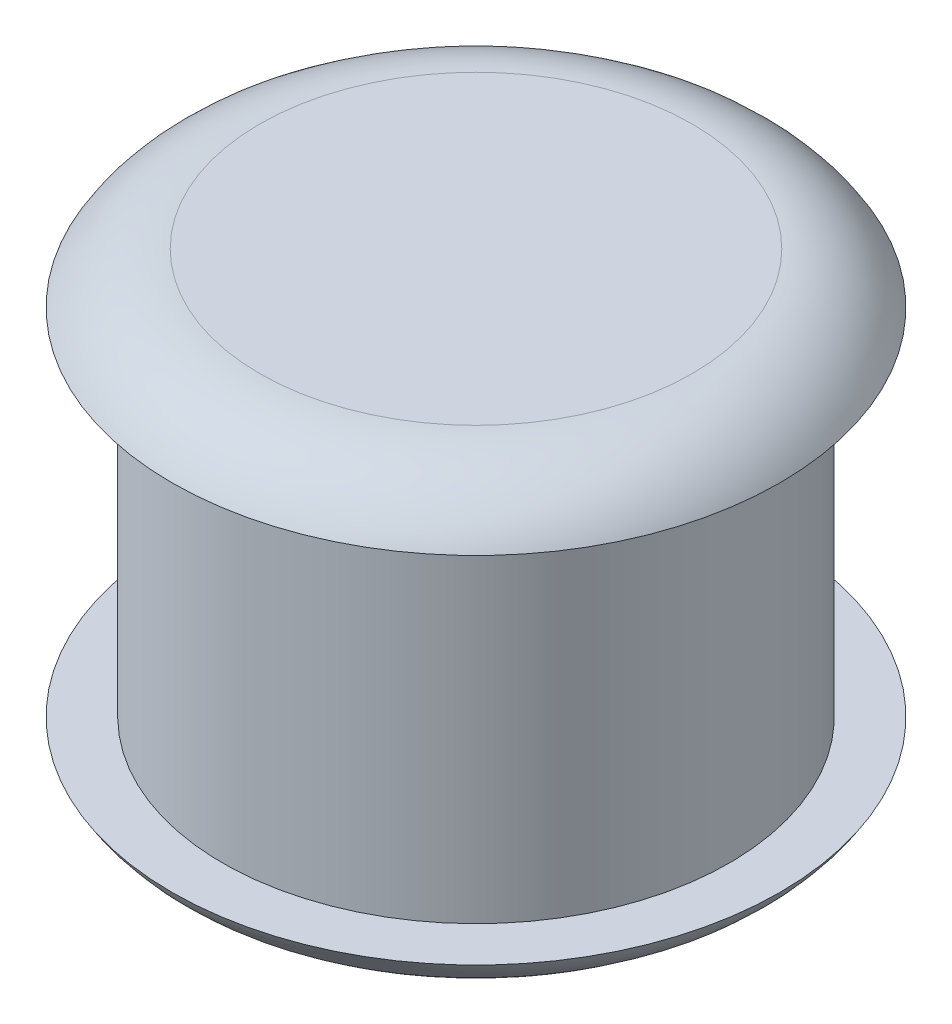
ISO-10303-21;
HEADER;
FILE_DESCRIPTION(('STEP AP214'),'2;1');
FILE_NAME('part.step','',(''),(''),'','','');
FILE_SCHEMA(('AUTOMOTIVE_DESIGN { 1 0 10303 214 1 1 1 1 }'));
ENDSEC;
DATA;
#1=APPLICATION_CONTEXT('core data for automotive mechanical design processes');
#2=APPLICATION_PROTOCOL_DEFINITION('international standard','automotive_design',2000,#1);
#3=PRODUCT_CONTEXT('',#1,'mechanical');
#4=PRODUCT('Part','Part','',(#3));
#5=PRODUCT_RELATED_PRODUCT_CATEGORY('part','',(#4));
#6=PRODUCT_DEFINITION_FORMATION('','',#4);
#7=PRODUCT_DEFINITION_CONTEXT('part definition',#1,'design');
#8=PRODUCT_DEFINITION('design','',#6,#7);
#9=PRODUCT_DEFINITION_SHAPE('','',#8);
#10=(LENGTH_UNIT() NAMED_UNIT(*) SI_UNIT(.MILLI.,.METRE.));
#11=(NAMED_UNIT(*) PLANE_ANGLE_UNIT() SI_UNIT($,.RADIAN.));
#12=(NAMED_UNIT(*) SI_UNIT($,.STERADIAN.) SOLID_ANGLE_UNIT());
#13=UNCERTAINTY_MEASURE_WITH_UNIT(LENGTH_MEASURE(1.E-05),#10,'distance_accuracy_value','');
#14=(GEOMETRIC_REPRESENTATION_CONTEXT(3) GLOBAL_UNCERTAINTY_ASSIGNED_CONTEXT((#13)) GLOBAL_UNIT_ASSIGNED_CONTEXT((#10,
#11,#12)) REPRESENTATION_CONTEXT('',''));
#15=CARTESIAN_POINT('',(0.,0.,0.));
#16=DIRECTION('',(0.,0.,1.));
#17=DIRECTION('',(1.,0.,0.));
#18=AXIS2_PLACEMENT_3D('',#15,#16,#17);
#19=CARTESIAN_POINT('',(0.,-179.614285714286,0.));
#20=DIRECTION('',(0.,1.,0.));
#21=DIRECTION('',(0.,0.,1.));
#22=AXIS2_PLACEMENT_3D('',#19,#20,#21);
#23=PLANE('',#22);
#24=CARTESIAN_POINT('',(0.,-179.614285714286,0.));
#25=DIRECTION('',(0.,1.,0.));
#26=DIRECTION('',(0.,0.,1.));
#27=AXIS2_PLACEMENT_3D('',#24,#25,#26);
#28=CIRCLE('',#27,46.4596754947502);
#29=CARTESIAN_POINT('',(0.,-179.614285714286,46.4596754947502));
#30=VERTEX_POINT('',#29);
#31=EDGE_CURVE('E10',#30,#30,#28,.T.);
#32=ORIENTED_EDGE('',*,*,#31,.T.);
#33=EDGE_LOOP('',(#32));
#34=FACE_BOUND('',#33,.T.);
#35=ADVANCED_FACE('F33',(#34),#23,.T.);
#36=CARTESIAN_POINT('',(65.3142857142857,-190.5,0.));
#37=DIRECTION('',(0.,-1.,0.));
#38=DIRECTION('',(0.,0.,-1.));
#39=AXIS2_PLACEMENT_3D('',#36,#37,#38);
#40=PLANE('',#39);
#41=CARTESIAN_POINT('',(0.,-190.5,0.));
#42=DIRECTION('',(0.,-1.,0.));
#43=DIRECTION('',(0.,0.,-1.));
#44=AXIS2_PLACEMENT_3D('',#41,#42,#43);
#45=CIRCLE('',#44,65.3142857142857);
#46=CARTESIAN_POINT('',(0.,-190.5,-65.3142857142857));
#47=VERTEX_POINT('',#46);
#48=EDGE_CURVE('E44',#47,#47,#45,.T.);
#49=ORIENTED_EDGE('',*,*,#48,.T.);
#50=EDGE_LOOP('',(#49));
#51=FACE_BOUND('',#50,.T.);
#52=CARTESIAN_POINT('',(0.,-190.5,0.));
#53=DIRECTION('',(0.,-1.,0.));
#54=DIRECTION('',(0.,0.,-1.));
#55=AXIS2_PLACEMENT_3D('',#52,#53,#54);
#56=CIRCLE('',#55,54.4285714285714);
#57=CARTESIAN_POINT('',(0.,-190.5,-54.4285714285714));
#58=VERTEX_POINT('',#57);
#59=EDGE_CURVE('E48',#58,#58,#56,.T.);
#60=ORIENTED_EDGE('',*,*,#59,.F.);
#61=EDGE_LOOP('',(#60));
#62=FACE_BOUND('',#61,.T.);
#63=ADVANCED_FACE('F74',(#51,#62),#40,.T.);
#64=CARTESIAN_POINT('',(0.,-277.585714285714,0.));
#65=DIRECTION('',(0.,-1.,0.));
#66=DIRECTION('',(0.,0.,-1.));
#67=AXIS2_PLACEMENT_3D('',#64,#65,#66);
#68=CYLINDRICAL_SURFACE('',#67,54.4285714285714);
#69=ORIENTED_EDGE('',*,*,#59,.T.);
#70=EDGE_LOOP('',(#69));
#71=FACE_BOUND('',#70,.T.);
#72=CARTESIAN_POINT('',(0.,-266.7,0.));
#73=DIRECTION('',(0.,-1.,0.));
#74=DIRECTION('',(0.,0.,-1.));
#75=AXIS2_PLACEMENT_3D('',#72,#73,#74);
#76=CIRCLE('',#75,54.4285714285714);
#77=CARTESIAN_POINT('',(0.,-266.7,-54.4285714285714));
#78=VERTEX_POINT('',#77);
#79=EDGE_CURVE('E53',#78,#78,#76,.T.);
#80=ORIENTED_EDGE('',*,*,#79,.F.);
#81=EDGE_LOOP('',(#80));
#82=FACE_BOUND('',#81,.T.);
#83=ADVANCED_FACE('F66',(#71,#82),#68,.T.);
#84=CARTESIAN_POINT('',(54.4285714285714,-266.7,0.));
#85=DIRECTION('',(0.,1.,0.));
#86=DIRECTION('',(0.,0.,1.));
#87=AXIS2_PLACEMENT_3D('',#84,#85,#86);
#88=PLANE('',#87);
#89=ORIENTED_EDGE('',*,*,#79,.T.);
#90=EDGE_LOOP('',(#89));
#91=FACE_BOUND('',#90,.T.);
#92=CARTESIAN_POINT('',(0.,-266.7,0.));
#93=DIRECTION('',(0.,-1.,0.));
#94=DIRECTION('',(0.,0.,-1.));
#95=AXIS2_PLACEMENT_3D('',#92,#93,#94);
#96=CIRCLE('',#95,65.3142857142857);
#97=CARTESIAN_POINT('',(0.,-266.7,-65.3142857142857));
#98=VERTEX_POINT('',#97);
#99=EDGE_CURVE('E56',#98,#98,#96,.T.);
#100=ORIENTED_EDGE('',*,*,#99,.F.);
#101=EDGE_LOOP('',(#100));
#102=FACE_BOUND('',#101,.T.);
#103=ADVANCED_FACE('F63',(#91,#102),#88,.T.);
#104=CARTESIAN_POINT('',(65.3142857142857,-277.585714285714,0.));
#105=DIRECTION('',(0.,-1.,0.));
#106=DIRECTION('',(0.,0.,-1.));
#107=AXIS2_PLACEMENT_3D('',#104,#105,#106);
#108=PLANE('',#107);
#109=CARTESIAN_POINT('',(0.,-277.585714285714,0.));
#110=DIRECTION('',(0.,-1.,0.));
#111=DIRECTION('',(0.,0.,-1.));
#112=AXIS2_PLACEMENT_3D('',#109,#110,#111);
#113=CIRCLE('',#112,46.4596754947502);
#114=CARTESIAN_POINT('',(0.,-277.585714285714,-46.4596754947502));
#115=VERTEX_POINT('',#114);
#116=EDGE_CURVE('E40',#115,#115,#113,.T.);
#117=ORIENTED_EDGE('',*,*,#116,.T.);
#118=EDGE_LOOP('',(#117));
#119=FACE_BOUND('',#118,.T.);
#120=ADVANCED_FACE('F65',(#119),#108,.T.);
#121=CARTESIAN_POINT('',(0.,-255.814285714286,0.));
#122=DIRECTION('',(0.,1.,0.));
#123=DIRECTION('',(0.,0.,1.));
#124=AXIS2_PLACEMENT_3D('',#121,#122,#123);
#125=TOROIDAL_SURFACE('',#124,46.4596754947502,21.7714285714286);
#126=ORIENTED_EDGE('',*,*,#99,.T.);
#127=EDGE_LOOP('',(#126));
#128=FACE_BOUND('',#127,.T.);
#129=ORIENTED_EDGE('',*,*,#116,.F.);
#130=EDGE_LOOP('',(#129));
#131=FACE_BOUND('',#130,.T.);
#132=ADVANCED_FACE('F60',(#128,#131),#125,.T.);
#133=CARTESIAN_POINT('',(0.,-201.385714285714,0.));
#134=DIRECTION('',(0.,-1.,0.));
#135=DIRECTION('',(0.,0.,-1.));
#136=AXIS2_PLACEMENT_3D('',#133,#134,#135);
#137=TOROIDAL_SURFACE('',#136,46.4596754947502,21.7714285714286);
#138=ORIENTED_EDGE('',*,*,#31,.F.);
#139=EDGE_LOOP('',(#138));
#140=FACE_BOUND('',#139,.T.);
#141=ORIENTED_EDGE('',*,*,#48,.F.);
#142=EDGE_LOOP('',(#141));
#143=FACE_BOUND('',#142,.T.);
#144=ADVANCED_FACE('F35',(#140,#143),#137,.T.);
#145=CLOSED_SHELL('',(#35,#63,#83,#103,#120,#132,#144));
#146=MANIFOLD_SOLID_BREP('B2',#145);
#147=ADVANCED_BREP_SHAPE_REPRESENTATION('',(#18,#146),#14);
#148=SHAPE_DEFINITION_REPRESENTATION(#9,#147);
ENDSEC;
END-ISO-10303-21;
